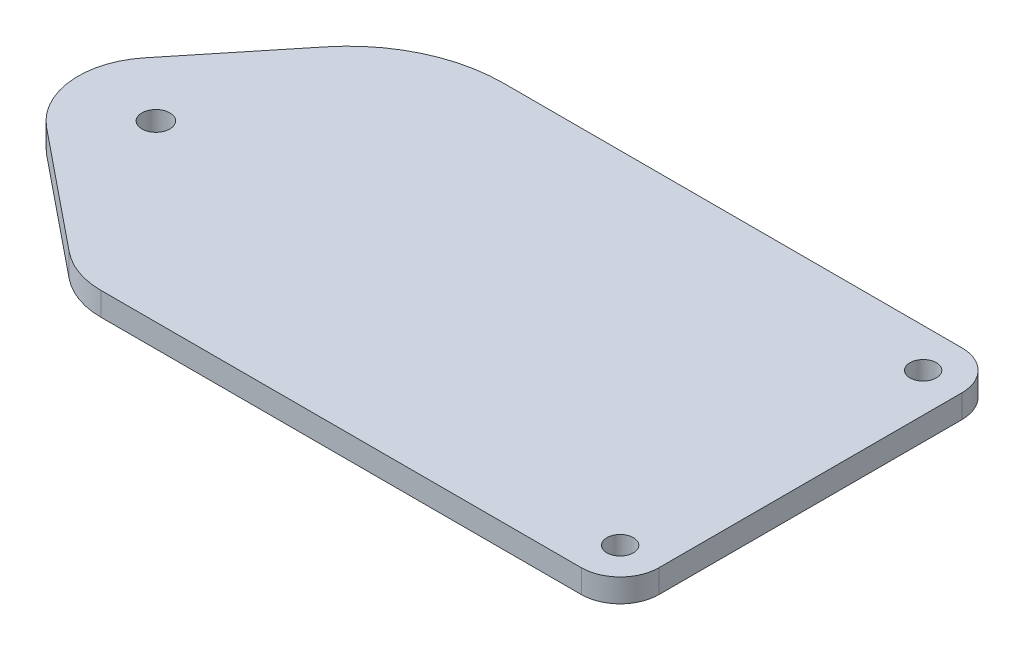
ISO-10303-21;
HEADER;
FILE_DESCRIPTION(('STEP AP214'),'2;1');
FILE_NAME('part.step','',(''),(''),'','','');
FILE_SCHEMA(('AUTOMOTIVE_DESIGN { 1 0 10303 214 1 1 1 1 }'));
ENDSEC;
DATA;
#1=APPLICATION_CONTEXT('core data for automotive mechanical design processes');
#2=APPLICATION_PROTOCOL_DEFINITION('international standard','automotive_design',2000,#1);
#3=PRODUCT_CONTEXT('',#1,'mechanical');
#4=PRODUCT('Part','Part','',(#3));
#5=PRODUCT_RELATED_PRODUCT_CATEGORY('part','',(#4));
#6=PRODUCT_DEFINITION_FORMATION('','',#4);
#7=PRODUCT_DEFINITION_CONTEXT('part definition',#1,'design');
#8=PRODUCT_DEFINITION('design','',#6,#7);
#9=PRODUCT_DEFINITION_SHAPE('','',#8);
#10=(LENGTH_UNIT() NAMED_UNIT(*) SI_UNIT(.MILLI.,.METRE.));
#11=(NAMED_UNIT(*) PLANE_ANGLE_UNIT() SI_UNIT($,.RADIAN.));
#12=(NAMED_UNIT(*) SI_UNIT($,.STERADIAN.) SOLID_ANGLE_UNIT());
#13=UNCERTAINTY_MEASURE_WITH_UNIT(LENGTH_MEASURE(1.E-05),#10,'distance_accuracy_value','');
#14=(GEOMETRIC_REPRESENTATION_CONTEXT(3) GLOBAL_UNCERTAINTY_ASSIGNED_CONTEXT((#13)) GLOBAL_UNIT_ASSIGNED_CONTEXT((#10,
#11,#12)) REPRESENTATION_CONTEXT('',''));
#15=CARTESIAN_POINT('',(0.,0.,0.));
#16=DIRECTION('',(0.,0.,1.));
#17=DIRECTION('',(1.,0.,0.));
#18=AXIS2_PLACEMENT_3D('',#15,#16,#17);
#19=CARTESIAN_POINT('',(22.832898339224,3.,-4.90714418224513));
#20=DIRECTION('',(0.,1.,0.));
#21=DIRECTION('',(0.,0.,1.));
#22=AXIS2_PLACEMENT_3D('',#19,#20,#21);
#23=PLANE('',#22);
#24=CARTESIAN_POINT('',(-54.3415677642179,3.,16.6724373208188));
#25=DIRECTION('',(0.,1.,0.));
#26=DIRECTION('',(0.,0.,1.));
#27=AXIS2_PLACEMENT_3D('',#24,#25,#26);
#28=CIRCLE('',#27,1.8);
#29=CARTESIAN_POINT('',(-54.3415677642179,3.,18.4724373208188));
#30=VERTEX_POINT('',#29);
#31=EDGE_CURVE('E304',#30,#30,#28,.T.);
#32=ORIENTED_EDGE('',*,*,#31,.F.);
#33=EDGE_LOOP('',(#32));
#34=FACE_BOUND('',#33,.T.);
#35=CARTESIAN_POINT('',(22.832898339224,3.,-4.90714418224513));
#36=DIRECTION('',(0.,1.,0.));
#37=DIRECTION('',(0.,0.,1.));
#38=AXIS2_PLACEMENT_3D('',#35,#36,#37);
#39=CIRCLE('',#38,1.7);
#40=CARTESIAN_POINT('',(22.832898339224,3.,-3.20714418224513));
#41=VERTEX_POINT('',#40);
#42=EDGE_CURVE('E160',#41,#41,#39,.T.);
#43=ORIENTED_EDGE('',*,*,#42,.F.);
#44=EDGE_LOOP('',(#43));
#45=FACE_BOUND('',#44,.T.);
#46=CARTESIAN_POINT('',(22.832898339224,3.,-4.90714418224513));
#47=DIRECTION('',(0.,1.,0.));
#48=DIRECTION('',(0.,0.,1.));
#49=AXIS2_PLACEMENT_3D('',#46,#47,#48);
#50=CIRCLE('',#49,5.);
#51=CARTESIAN_POINT('',(27.832898339224,3.,-4.90714418224509));
#52=VERTEX_POINT('',#51);
#53=CARTESIAN_POINT('',(22.832898339224,3.,-9.90714418224513));
#54=VERTEX_POINT('',#53);
#55=EDGE_CURVE('E176',#52,#54,#50,.T.);
#56=ORIENTED_EDGE('',*,*,#55,.T.);
#57=DIRECTION('',(-1.,0.,0.));
#58=VECTOR('',#57,1.);
#59=CARTESIAN_POINT('',(-36.1434619683259,3.,-9.90714418224513));
#60=LINE('',#59,#58);
#61=CARTESIAN_POINT('',(-36.1434619683259,3.,-9.90714418224513));
#62=VERTEX_POINT('',#61);
#63=EDGE_CURVE('E106',#54,#62,#60,.T.);
#64=ORIENTED_EDGE('',*,*,#63,.T.);
#65=CARTESIAN_POINT('',(-36.1434619683259,3.,10.0928558177549));
#66=DIRECTION('',(0.,1.,0.));
#67=DIRECTION('',(0.,0.,1.));
#68=AXIS2_PLACEMENT_3D('',#65,#66,#67);
#69=CIRCLE('',#68,20.);
#70=CARTESIAN_POINT('',(-51.684922643577,3.,-2.49535295393402));
#71=VERTEX_POINT('',#70);
#72=EDGE_CURVE('E198',#62,#71,#69,.T.);
#73=ORIENTED_EDGE('',*,*,#72,.T.);
#74=DIRECTION('',(-0.629410438584448,0.,0.77707303376255));
#75=VECTOR('',#74,1.);
#76=CARTESIAN_POINT('',(-51.684922643577,3.,-2.49535295393402));
#77=LINE('',#76,#75);
#78=CARTESIAN_POINT('',(-62.1122981018434,3.,10.3783329349743));
#79=VERTEX_POINT('',#78);
#80=EDGE_CURVE('E217',#71,#79,#77,.T.);
#81=ORIENTED_EDGE('',*,*,#80,.T.);
#82=CARTESIAN_POINT('',(-54.3415677642179,3.,16.6724373208188));
#83=DIRECTION('',(0.,1.,0.));
#84=DIRECTION('',(0.,0.,1.));
#85=AXIS2_PLACEMENT_3D('',#82,#83,#84);
#86=CIRCLE('',#85,10.);
#87=CARTESIAN_POINT('',(-60.6356721500624,3.,24.4431676584444));
#88=VERTEX_POINT('',#87);
#89=EDGE_CURVE('E214',#79,#88,#86,.T.);
#90=ORIENTED_EDGE('',*,*,#89,.T.);
#91=DIRECTION('',(0.77707303376255,0.,0.629410438584448));
#92=VECTOR('',#91,1.);
#93=CARTESIAN_POINT('',(-45.3013661227886,3.,36.8635861553804));
#94=LINE('',#93,#92);
#95=CARTESIAN_POINT('',(-45.3013661227886,3.,36.8635861553804));
#96=VERTEX_POINT('',#95);
#97=EDGE_CURVE('E216',#88,#96,#94,.T.);
#98=ORIENTED_EDGE('',*,*,#97,.T.);
#99=CARTESIAN_POINT('',(-39.0072617369441,3.,29.0928558177549));
#100=DIRECTION('',(0.,1.,0.));
#101=DIRECTION('',(0.,0.,-1.));
#102=AXIS2_PLACEMENT_3D('',#99,#100,#101);
#103=CIRCLE('',#102,10.);
#104=CARTESIAN_POINT('',(-39.007261736944,3.,39.0928558177549));
#105=VERTEX_POINT('',#104);
#106=EDGE_CURVE('E135',#96,#105,#103,.T.);
#107=ORIENTED_EDGE('',*,*,#106,.T.);
#108=DIRECTION('',(1.,0.,0.));
#109=VECTOR('',#108,1.);
#110=CARTESIAN_POINT('',(-39.007261736944,3.,39.0928558177549));
#111=LINE('',#110,#109);
#112=CARTESIAN_POINT('',(22.832898339224,3.,39.0928558177549));
#113=VERTEX_POINT('',#112);
#114=EDGE_CURVE('E128',#105,#113,#111,.T.);
#115=ORIENTED_EDGE('',*,*,#114,.T.);
#116=CARTESIAN_POINT('',(22.832898339224,3.,34.0928558177549));
#117=DIRECTION('',(0.,1.,0.));
#118=DIRECTION('',(0.,0.,-1.));
#119=AXIS2_PLACEMENT_3D('',#116,#117,#118);
#120=CIRCLE('',#119,5.);
#121=CARTESIAN_POINT('',(27.832898339224,3.,34.0928558177548));
#122=VERTEX_POINT('',#121);
#123=EDGE_CURVE('E132',#113,#122,#120,.T.);
#124=ORIENTED_EDGE('',*,*,#123,.T.);
#125=DIRECTION('',(0.,0.,-1.));
#126=VECTOR('',#125,1.);
#127=CARTESIAN_POINT('',(27.832898339224,3.,-4.90714418224509));
#128=LINE('',#127,#126);
#129=EDGE_CURVE('E59',#122,#52,#128,.T.);
#130=ORIENTED_EDGE('',*,*,#129,.T.);
#131=EDGE_LOOP('',(#56,#64,#73,#81,#90,#98,#107,#115,#124,#130));
#132=FACE_BOUND('',#131,.T.);
#133=CARTESIAN_POINT('',(22.832898339224,3.,34.0928558177549));
#134=DIRECTION('',(0.,1.,0.));
#135=DIRECTION('',(0.,0.,1.));
#136=AXIS2_PLACEMENT_3D('',#133,#134,#135);
#137=CIRCLE('',#136,1.7);
#138=CARTESIAN_POINT('',(22.832898339224,3.,35.7928558177549));
#139=VERTEX_POINT('',#138);
#140=EDGE_CURVE('E228',#139,#139,#137,.T.);
#141=ORIENTED_EDGE('',*,*,#140,.F.);
#142=EDGE_LOOP('',(#141));
#143=FACE_BOUND('',#142,.T.);
#144=ADVANCED_FACE('F34',(#34,#45,#132,#143),#23,.T.);
#145=CARTESIAN_POINT('',(22.832898339224,0.,-4.90714418224513));
#146=DIRECTION('',(0.,1.,0.));
#147=DIRECTION('',(0.,0.,1.));
#148=AXIS2_PLACEMENT_3D('',#145,#146,#147);
#149=PLANE('',#148);
#150=CARTESIAN_POINT('',(-54.3415677642179,0.,16.6724373208188));
#151=DIRECTION('',(0.,1.,0.));
#152=DIRECTION('',(0.,0.,1.));
#153=AXIS2_PLACEMENT_3D('',#150,#151,#152);
#154=CIRCLE('',#153,1.8);
#155=CARTESIAN_POINT('',(-54.3415677642179,0.,18.4724373208188));
#156=VERTEX_POINT('',#155);
#157=EDGE_CURVE('E38',#156,#156,#154,.T.);
#158=ORIENTED_EDGE('',*,*,#157,.T.);
#159=EDGE_LOOP('',(#158));
#160=FACE_BOUND('',#159,.T.);
#161=DIRECTION('',(1.,0.,0.));
#162=VECTOR('',#161,1.);
#163=CARTESIAN_POINT('',(0.,0.,-6.92704949976933));
#164=LINE('',#163,#162);
#165=CARTESIAN_POINT('',(-41.2166549540158,0.,-6.92704949976933));
#166=VERTEX_POINT('',#165);
#167=CARTESIAN_POINT('',(18.7833450459842,0.,-6.92704949976933));
#168=VERTEX_POINT('',#167);
#169=EDGE_CURVE('E276',#166,#168,#164,.T.);
#170=ORIENTED_EDGE('',*,*,#169,.F.);
#171=CARTESIAN_POINT('',(-41.2166549540158,0.,-5.92704949976933));
#172=DIRECTION('',(0.,-1.,0.));
#173=DIRECTION('',(0.,0.,-1.));
#174=AXIS2_PLACEMENT_3D('',#171,#172,#173);
#175=CIRCLE('',#174,1.);
#176=CARTESIAN_POINT('',(-42.2166549540158,0.,-5.92704949976933));
#177=VERTEX_POINT('',#176);
#178=EDGE_CURVE('E279',#166,#177,#175,.F.);
#179=ORIENTED_EDGE('',*,*,#178,.T.);
#180=DIRECTION('',(0.,0.,1.));
#181=VECTOR('',#180,1.);
#182=CARTESIAN_POINT('',(-42.2166549540158,0.,0.));
#183=LINE('',#182,#181);
#184=CARTESIAN_POINT('',(-42.2166549540158,0.,35.0729505002307));
#185=VERTEX_POINT('',#184);
#186=EDGE_CURVE('E259',#177,#185,#183,.T.);
#187=ORIENTED_EDGE('',*,*,#186,.T.);
#188=CARTESIAN_POINT('',(-41.2166549540158,0.,35.0729505002307));
#189=DIRECTION('',(0.,-1.,0.));
#190=DIRECTION('',(0.,0.,-1.));
#191=AXIS2_PLACEMENT_3D('',#188,#189,#190);
#192=CIRCLE('',#191,1.00000000000001);
#193=CARTESIAN_POINT('',(-41.2166549540158,0.,36.0729505002307));
#194=VERTEX_POINT('',#193);
#195=EDGE_CURVE('E50',#194,#185,#192,.T.);
#196=ORIENTED_EDGE('',*,*,#195,.F.);
#197=DIRECTION('',(1.,0.,0.));
#198=VECTOR('',#197,1.);
#199=CARTESIAN_POINT('',(0.,0.,36.0729505002307));
#200=LINE('',#199,#198);
#201=CARTESIAN_POINT('',(18.7833450459842,0.,36.0729505002307));
#202=VERTEX_POINT('',#201);
#203=EDGE_CURVE('E264',#194,#202,#200,.T.);
#204=ORIENTED_EDGE('',*,*,#203,.T.);
#205=CARTESIAN_POINT('',(18.7833450459842,0.,35.0729505002307));
#206=DIRECTION('',(0.,-1.,0.));
#207=DIRECTION('',(0.,0.,-1.));
#208=AXIS2_PLACEMENT_3D('',#205,#206,#207);
#209=CIRCLE('',#208,1.00000000000003);
#210=CARTESIAN_POINT('',(19.7833450459842,0.,35.0729505002307));
#211=VERTEX_POINT('',#210);
#212=EDGE_CURVE('E267',#211,#202,#209,.T.);
#213=ORIENTED_EDGE('',*,*,#212,.F.);
#214=DIRECTION('',(0.,0.,1.));
#215=VECTOR('',#214,1.);
#216=CARTESIAN_POINT('',(19.7833450459842,0.,0.));
#217=LINE('',#216,#215);
#218=CARTESIAN_POINT('',(19.7833450459842,0.,-5.92704949976933));
#219=VERTEX_POINT('',#218);
#220=EDGE_CURVE('E270',#219,#211,#217,.T.);
#221=ORIENTED_EDGE('',*,*,#220,.F.);
#222=CARTESIAN_POINT('',(18.7833450459842,0.,-5.92704949976933));
#223=DIRECTION('',(0.,-1.,0.));
#224=DIRECTION('',(0.,0.,-1.));
#225=AXIS2_PLACEMENT_3D('',#222,#223,#224);
#226=CIRCLE('',#225,1.);
#227=EDGE_CURVE('E273',#219,#168,#226,.F.);
#228=ORIENTED_EDGE('',*,*,#227,.T.);
#229=EDGE_LOOP('',(#170,#179,#187,#196,#204,#213,#221,#228));
#230=FACE_BOUND('',#229,.T.);
#231=CARTESIAN_POINT('',(22.832898339224,0.,-4.90714418224513));
#232=DIRECTION('',(0.,1.,0.));
#233=DIRECTION('',(0.,0.,1.));
#234=AXIS2_PLACEMENT_3D('',#231,#232,#233);
#235=CIRCLE('',#234,5.);
#236=CARTESIAN_POINT('',(27.832898339224,0.,-4.90714418224509));
#237=VERTEX_POINT('',#236);
#238=CARTESIAN_POINT('',(22.832898339224,0.,-9.90714418224513));
#239=VERTEX_POINT('',#238);
#240=EDGE_CURVE('E156',#237,#239,#235,.T.);
#241=ORIENTED_EDGE('',*,*,#240,.F.);
#242=DIRECTION('',(0.,0.,-1.));
#243=VECTOR('',#242,1.);
#244=CARTESIAN_POINT('',(27.832898339224,0.,-4.90714418224509));
#245=LINE('',#244,#243);
#246=CARTESIAN_POINT('',(27.832898339224,0.,34.0928558177548));
#247=VERTEX_POINT('',#246);
#248=EDGE_CURVE('E98',#247,#237,#245,.T.);
#249=ORIENTED_EDGE('',*,*,#248,.F.);
#250=CARTESIAN_POINT('',(22.832898339224,0.,34.0928558177549));
#251=DIRECTION('',(0.,1.,0.));
#252=DIRECTION('',(0.,0.,-1.));
#253=AXIS2_PLACEMENT_3D('',#250,#251,#252);
#254=CIRCLE('',#253,5.);
#255=CARTESIAN_POINT('',(22.832898339224,0.,39.0928558177549));
#256=VERTEX_POINT('',#255);
#257=EDGE_CURVE('E173',#256,#247,#254,.T.);
#258=ORIENTED_EDGE('',*,*,#257,.F.);
#259=DIRECTION('',(1.,0.,0.));
#260=VECTOR('',#259,1.);
#261=CARTESIAN_POINT('',(-39.007261736944,0.,39.0928558177549));
#262=LINE('',#261,#260);
#263=CARTESIAN_POINT('',(-39.007261736944,0.,39.0928558177549));
#264=VERTEX_POINT('',#263);
#265=EDGE_CURVE('E144',#264,#256,#262,.T.);
#266=ORIENTED_EDGE('',*,*,#265,.F.);
#267=CARTESIAN_POINT('',(-39.0072617369441,0.,29.0928558177549));
#268=DIRECTION('',(0.,1.,0.));
#269=DIRECTION('',(0.,0.,-1.));
#270=AXIS2_PLACEMENT_3D('',#267,#268,#269);
#271=CIRCLE('',#270,10.);
#272=CARTESIAN_POINT('',(-45.3013661227886,0.,36.8635861553804));
#273=VERTEX_POINT('',#272);
#274=EDGE_CURVE('E170',#273,#264,#271,.T.);
#275=ORIENTED_EDGE('',*,*,#274,.F.);
#276=DIRECTION('',(0.77707303376255,0.,0.629410438584448));
#277=VECTOR('',#276,1.);
#278=CARTESIAN_POINT('',(-45.3013661227886,0.,36.8635861553804));
#279=LINE('',#278,#277);
#280=CARTESIAN_POINT('',(-60.6356721500624,0.,24.4431676584444));
#281=VERTEX_POINT('',#280);
#282=EDGE_CURVE('E168',#281,#273,#279,.T.);
#283=ORIENTED_EDGE('',*,*,#282,.F.);
#284=CARTESIAN_POINT('',(-54.3415677642179,0.,16.6724373208188));
#285=DIRECTION('',(0.,1.,0.));
#286=DIRECTION('',(0.,0.,1.));
#287=AXIS2_PLACEMENT_3D('',#284,#285,#286);
#288=CIRCLE('',#287,10.);
#289=CARTESIAN_POINT('',(-62.1122981018434,0.,10.3783329349743));
#290=VERTEX_POINT('',#289);
#291=EDGE_CURVE('E166',#290,#281,#288,.T.);
#292=ORIENTED_EDGE('',*,*,#291,.F.);
#293=DIRECTION('',(-0.629410438584448,0.,0.77707303376255));
#294=VECTOR('',#293,1.);
#295=CARTESIAN_POINT('',(-51.684922643577,0.,-2.49535295393402));
#296=LINE('',#295,#294);
#297=CARTESIAN_POINT('',(-51.684922643577,0.,-2.49535295393402));
#298=VERTEX_POINT('',#297);
#299=EDGE_CURVE('E164',#298,#290,#296,.T.);
#300=ORIENTED_EDGE('',*,*,#299,.F.);
#301=CARTESIAN_POINT('',(-36.1434619683259,0.,10.0928558177549));
#302=DIRECTION('',(0.,1.,0.));
#303=DIRECTION('',(0.,0.,1.));
#304=AXIS2_PLACEMENT_3D('',#301,#302,#303);
#305=CIRCLE('',#304,20.);
#306=CARTESIAN_POINT('',(-36.1434619683259,0.,-9.90714418224513));
#307=VERTEX_POINT('',#306);
#308=EDGE_CURVE('E162',#307,#298,#305,.T.);
#309=ORIENTED_EDGE('',*,*,#308,.F.);
#310=DIRECTION('',(-1.,0.,0.));
#311=VECTOR('',#310,1.);
#312=CARTESIAN_POINT('',(-36.1434619683259,0.,-9.90714418224513));
#313=LINE('',#312,#311);
#314=EDGE_CURVE('E159',#239,#307,#313,.T.);
#315=ORIENTED_EDGE('',*,*,#314,.F.);
#316=EDGE_LOOP('',(#241,#249,#258,#266,#275,#283,#292,#300,#309,#315));
#317=FACE_BOUND('',#316,.T.);
#318=CARTESIAN_POINT('',(22.832898339224,0.,-4.90714418224513));
#319=DIRECTION('',(0.,1.,0.));
#320=DIRECTION('',(0.,0.,1.));
#321=AXIS2_PLACEMENT_3D('',#318,#319,#320);
#322=CIRCLE('',#321,1.7);
#323=CARTESIAN_POINT('',(22.832898339224,0.,-3.20714418224513));
#324=VERTEX_POINT('',#323);
#325=EDGE_CURVE('E225',#324,#324,#322,.T.);
#326=ORIENTED_EDGE('',*,*,#325,.T.);
#327=EDGE_LOOP('',(#326));
#328=FACE_BOUND('',#327,.T.);
#329=CARTESIAN_POINT('',(22.832898339224,0.,34.0928558177549));
#330=DIRECTION('',(0.,1.,0.));
#331=DIRECTION('',(0.,0.,1.));
#332=AXIS2_PLACEMENT_3D('',#329,#330,#331);
#333=CIRCLE('',#332,1.7);
#334=CARTESIAN_POINT('',(22.832898339224,0.,35.7928558177549));
#335=VERTEX_POINT('',#334);
#336=EDGE_CURVE('E231',#335,#335,#333,.T.);
#337=ORIENTED_EDGE('',*,*,#336,.T.);
#338=EDGE_LOOP('',(#337));
#339=FACE_BOUND('',#338,.T.);
#340=ADVANCED_FACE('F202',(#160,#230,#317,#328,#339),#149,.F.);
#341=CARTESIAN_POINT('',(22.832898339224,3.,-4.90714418224513));
#342=DIRECTION('',(0.,-1.,0.));
#343=DIRECTION('',(0.,0.,-1.));
#344=AXIS2_PLACEMENT_3D('',#341,#342,#343);
#345=CYLINDRICAL_SURFACE('',#344,5.);
#346=ORIENTED_EDGE('',*,*,#240,.T.);
#347=DIRECTION('',(0.,-1.,0.));
#348=VECTOR('',#347,1.);
#349=CARTESIAN_POINT('',(22.832898339224,3.,-9.90714418224513));
#350=LINE('',#349,#348);
#351=EDGE_CURVE('E11',#54,#239,#350,.T.);
#352=ORIENTED_EDGE('',*,*,#351,.F.);
#353=ORIENTED_EDGE('',*,*,#55,.F.);
#354=DIRECTION('',(0.,-1.,0.));
#355=VECTOR('',#354,1.);
#356=CARTESIAN_POINT('',(27.832898339224,3.,-4.90714418224509));
#357=LINE('',#356,#355);
#358=EDGE_CURVE('E152',#52,#237,#357,.T.);
#359=ORIENTED_EDGE('',*,*,#358,.T.);
#360=EDGE_LOOP('',(#346,#352,#353,#359));
#361=FACE_BOUND('',#360,.T.);
#362=ADVANCED_FACE('F36',(#361),#345,.T.);
#363=CARTESIAN_POINT('',(-36.1434619683259,3.,-9.90714418224513));
#364=DIRECTION('',(0.,0.,1.));
#365=DIRECTION('',(1.,0.,0.));
#366=AXIS2_PLACEMENT_3D('',#363,#364,#365);
#367=PLANE('',#366);
#368=ORIENTED_EDGE('',*,*,#314,.T.);
#369=DIRECTION('',(0.,-1.,0.));
#370=VECTOR('',#369,1.);
#371=CARTESIAN_POINT('',(-36.1434619683259,3.,-9.90714418224513));
#372=LINE('',#371,#370);
#373=EDGE_CURVE('E43',#62,#307,#372,.T.);
#374=ORIENTED_EDGE('',*,*,#373,.F.);
#375=ORIENTED_EDGE('',*,*,#63,.F.);
#376=ORIENTED_EDGE('',*,*,#351,.T.);
#377=EDGE_LOOP('',(#368,#374,#375,#376));
#378=FACE_BOUND('',#377,.T.);
#379=ADVANCED_FACE('F355',(#378),#367,.F.);
#380=CARTESIAN_POINT('',(-36.1434619683259,3.,10.0928558177549));
#381=DIRECTION('',(0.,-1.,0.));
#382=DIRECTION('',(0.,0.,-1.));
#383=AXIS2_PLACEMENT_3D('',#380,#381,#382);
#384=CYLINDRICAL_SURFACE('',#383,20.);
#385=ORIENTED_EDGE('',*,*,#308,.T.);
#386=DIRECTION('',(0.,-1.,0.));
#387=VECTOR('',#386,1.);
#388=CARTESIAN_POINT('',(-51.684922643577,3.,-2.49535295393402));
#389=LINE('',#388,#387);
#390=EDGE_CURVE('E189',#71,#298,#389,.T.);
#391=ORIENTED_EDGE('',*,*,#390,.F.);
#392=ORIENTED_EDGE('',*,*,#72,.F.);
#393=ORIENTED_EDGE('',*,*,#373,.T.);
#394=EDGE_LOOP('',(#385,#391,#392,#393));
#395=FACE_BOUND('',#394,.T.);
#396=ADVANCED_FACE('F196',(#395),#384,.T.);
#397=CARTESIAN_POINT('',(-51.684922643577,3.,-2.49535295393402));
#398=DIRECTION('',(0.77707303376255,0.,0.629410438584448));
#399=DIRECTION('',(0.629410438584448,0.,-0.77707303376255));
#400=AXIS2_PLACEMENT_3D('',#397,#398,#399);
#401=PLANE('',#400);
#402=ORIENTED_EDGE('',*,*,#299,.T.);
#403=DIRECTION('',(0.,-1.,0.));
#404=VECTOR('',#403,1.);
#405=CARTESIAN_POINT('',(-62.1122981018434,3.,10.3783329349743));
#406=LINE('',#405,#404);
#407=EDGE_CURVE('E186',#79,#290,#406,.T.);
#408=ORIENTED_EDGE('',*,*,#407,.F.);
#409=ORIENTED_EDGE('',*,*,#80,.F.);
#410=ORIENTED_EDGE('',*,*,#390,.T.);
#411=EDGE_LOOP('',(#402,#408,#409,#410));
#412=FACE_BOUND('',#411,.T.);
#413=ADVANCED_FACE('F208',(#412),#401,.F.);
#414=CARTESIAN_POINT('',(-54.3415677642179,3.,16.6724373208188));
#415=DIRECTION('',(0.,-1.,0.));
#416=DIRECTION('',(0.,0.,-1.));
#417=AXIS2_PLACEMENT_3D('',#414,#415,#416);
#418=CYLINDRICAL_SURFACE('',#417,10.);
#419=ORIENTED_EDGE('',*,*,#291,.T.);
#420=DIRECTION('',(0.,-1.,0.));
#421=VECTOR('',#420,1.);
#422=CARTESIAN_POINT('',(-60.6356721500624,3.,24.4431676584444));
#423=LINE('',#422,#421);
#424=EDGE_CURVE('E183',#88,#281,#423,.T.);
#425=ORIENTED_EDGE('',*,*,#424,.F.);
#426=ORIENTED_EDGE('',*,*,#89,.F.);
#427=ORIENTED_EDGE('',*,*,#407,.T.);
#428=EDGE_LOOP('',(#419,#425,#426,#427));
#429=FACE_BOUND('',#428,.T.);
#430=ADVANCED_FACE('F212',(#429),#418,.T.);
#431=CARTESIAN_POINT('',(-45.3013661227886,3.,36.8635861553804));
#432=DIRECTION('',(0.629410438584448,0.,-0.777073033762549));
#433=DIRECTION('',(-0.77707303376255,0.,-0.629410438584448));
#434=AXIS2_PLACEMENT_3D('',#431,#432,#433);
#435=PLANE('',#434);
#436=ORIENTED_EDGE('',*,*,#282,.T.);
#437=DIRECTION('',(0.,-1.,0.));
#438=VECTOR('',#437,1.);
#439=CARTESIAN_POINT('',(-45.3013661227886,3.,36.8635861553804));
#440=LINE('',#439,#438);
#441=EDGE_CURVE('E180',#96,#273,#440,.T.);
#442=ORIENTED_EDGE('',*,*,#441,.F.);
#443=ORIENTED_EDGE('',*,*,#97,.F.);
#444=ORIENTED_EDGE('',*,*,#424,.T.);
#445=EDGE_LOOP('',(#436,#442,#443,#444));
#446=FACE_BOUND('',#445,.T.);
#447=ADVANCED_FACE('F345',(#446),#435,.F.);
#448=CARTESIAN_POINT('',(-39.0072617369441,3.,29.0928558177549));
#449=DIRECTION('',(0.,-1.,0.));
#450=DIRECTION('',(0.,0.,-1.));
#451=AXIS2_PLACEMENT_3D('',#448,#449,#450);
#452=CYLINDRICAL_SURFACE('',#451,10.);
#453=ORIENTED_EDGE('',*,*,#274,.T.);
#454=DIRECTION('',(0.,-1.,0.));
#455=VECTOR('',#454,1.);
#456=CARTESIAN_POINT('',(-39.007261736944,3.,39.0928558177549));
#457=LINE('',#456,#455);
#458=EDGE_CURVE('E147',#105,#264,#457,.T.);
#459=ORIENTED_EDGE('',*,*,#458,.F.);
#460=ORIENTED_EDGE('',*,*,#106,.F.);
#461=ORIENTED_EDGE('',*,*,#441,.T.);
#462=EDGE_LOOP('',(#453,#459,#460,#461));
#463=FACE_BOUND('',#462,.T.);
#464=ADVANCED_FACE('F342',(#463),#452,.T.);
#465=CARTESIAN_POINT('',(-39.007261736944,3.,39.0928558177549));
#466=DIRECTION('',(0.,0.,-1.));
#467=DIRECTION('',(-1.,0.,0.));
#468=AXIS2_PLACEMENT_3D('',#465,#466,#467);
#469=PLANE('',#468);
#470=ORIENTED_EDGE('',*,*,#265,.T.);
#471=DIRECTION('',(0.,-1.,0.));
#472=VECTOR('',#471,1.);
#473=CARTESIAN_POINT('',(22.832898339224,3.,39.0928558177549));
#474=LINE('',#473,#472);
#475=EDGE_CURVE('E141',#113,#256,#474,.T.);
#476=ORIENTED_EDGE('',*,*,#475,.F.);
#477=ORIENTED_EDGE('',*,*,#114,.F.);
#478=ORIENTED_EDGE('',*,*,#458,.T.);
#479=EDGE_LOOP('',(#470,#476,#477,#478));
#480=FACE_BOUND('',#479,.T.);
#481=ADVANCED_FACE('F142',(#480),#469,.F.);
#482=CARTESIAN_POINT('',(22.832898339224,3.,34.0928558177549));
#483=DIRECTION('',(0.,-1.,0.));
#484=DIRECTION('',(0.,0.,-1.));
#485=AXIS2_PLACEMENT_3D('',#482,#483,#484);
#486=CYLINDRICAL_SURFACE('',#485,5.);
#487=ORIENTED_EDGE('',*,*,#257,.T.);
#488=DIRECTION('',(0.,-1.,0.));
#489=VECTOR('',#488,1.);
#490=CARTESIAN_POINT('',(27.832898339224,3.,34.0928558177548));
#491=LINE('',#490,#489);
#492=EDGE_CURVE('E148',#122,#247,#491,.T.);
#493=ORIENTED_EDGE('',*,*,#492,.F.);
#494=ORIENTED_EDGE('',*,*,#123,.F.);
#495=ORIENTED_EDGE('',*,*,#475,.T.);
#496=EDGE_LOOP('',(#487,#493,#494,#495));
#497=FACE_BOUND('',#496,.T.);
#498=ADVANCED_FACE('F150',(#497),#486,.T.);
#499=CARTESIAN_POINT('',(27.832898339224,3.,-4.90714418224509));
#500=DIRECTION('',(-1.,0.,0.));
#501=DIRECTION('',(0.,0.,1.));
#502=AXIS2_PLACEMENT_3D('',#499,#500,#501);
#503=PLANE('',#502);
#504=ORIENTED_EDGE('',*,*,#248,.T.);
#505=ORIENTED_EDGE('',*,*,#358,.F.);
#506=ORIENTED_EDGE('',*,*,#129,.F.);
#507=ORIENTED_EDGE('',*,*,#492,.T.);
#508=EDGE_LOOP('',(#504,#505,#506,#507));
#509=FACE_BOUND('',#508,.T.);
#510=ADVANCED_FACE('F335',(#509),#503,.F.);
#511=CARTESIAN_POINT('',(22.832898339224,3.,-4.90714418224513));
#512=DIRECTION('',(0.,-1.,0.));
#513=DIRECTION('',(0.,0.,-1.));
#514=AXIS2_PLACEMENT_3D('',#511,#512,#513);
#515=CYLINDRICAL_SURFACE('',#514,1.7);
#516=ORIENTED_EDGE('',*,*,#42,.T.);
#517=EDGE_LOOP('',(#516));
#518=FACE_BOUND('',#517,.T.);
#519=ORIENTED_EDGE('',*,*,#325,.F.);
#520=EDGE_LOOP('',(#519));
#521=FACE_BOUND('',#520,.T.);
#522=ADVANCED_FACE('F332',(#518,#521),#515,.F.);
#523=CARTESIAN_POINT('',(22.832898339224,3.,34.0928558177549));
#524=DIRECTION('',(0.,-1.,0.));
#525=DIRECTION('',(0.,0.,-1.));
#526=AXIS2_PLACEMENT_3D('',#523,#524,#525);
#527=CYLINDRICAL_SURFACE('',#526,1.7);
#528=ORIENTED_EDGE('',*,*,#140,.T.);
#529=EDGE_LOOP('',(#528));
#530=FACE_BOUND('',#529,.T.);
#531=ORIENTED_EDGE('',*,*,#336,.F.);
#532=EDGE_LOOP('',(#531));
#533=FACE_BOUND('',#532,.T.);
#534=ADVANCED_FACE('F454',(#530,#533),#527,.F.);
#535=CARTESIAN_POINT('',(-41.2166549540158,-3.,-5.92704949976933));
#536=DIRECTION('',(0.,1.,0.));
#537=DIRECTION('',(0.,0.,1.));
#538=AXIS2_PLACEMENT_3D('',#535,#536,#537);
#539=CYLINDRICAL_SURFACE('',#538,1.);
#540=ORIENTED_EDGE('',*,*,#178,.F.);
#541=DIRECTION('',(0.,1.,0.));
#542=VECTOR('',#541,1.);
#543=CARTESIAN_POINT('',(-41.2166549540158,-3.,-6.92704949976933));
#544=LINE('',#543,#542);
#545=CARTESIAN_POINT('',(-41.2166549540158,-3.,-6.92704949976933));
#546=VERTEX_POINT('',#545);
#547=EDGE_CURVE('E234',#546,#166,#544,.T.);
#548=ORIENTED_EDGE('',*,*,#547,.F.);
#549=CARTESIAN_POINT('',(-41.2166549540158,-3.,-5.92704949976933));
#550=DIRECTION('',(0.,-1.,0.));
#551=DIRECTION('',(0.,0.,-1.));
#552=AXIS2_PLACEMENT_3D('',#549,#550,#551);
#553=CIRCLE('',#552,1.);
#554=CARTESIAN_POINT('',(-42.2166549540158,-3.,-5.92704949976933));
#555=VERTEX_POINT('',#554);
#556=EDGE_CURVE('E262',#546,#555,#553,.F.);
#557=ORIENTED_EDGE('',*,*,#556,.T.);
#558=DIRECTION('',(0.,1.,0.));
#559=VECTOR('',#558,1.);
#560=CARTESIAN_POINT('',(-42.2166549540158,-3.,-5.92704949976933));
#561=LINE('',#560,#559);
#562=EDGE_CURVE('E255',#555,#177,#561,.T.);
#563=ORIENTED_EDGE('',*,*,#562,.T.);
#564=EDGE_LOOP('',(#540,#548,#557,#563));
#565=FACE_BOUND('',#564,.T.);
#566=ADVANCED_FACE('F445',(#565),#539,.T.);
#567=CARTESIAN_POINT('',(0.,-3.,-6.92704949976933));
#568=DIRECTION('',(0.,0.,1.));
#569=DIRECTION('',(1.,0.,0.));
#570=AXIS2_PLACEMENT_3D('',#567,#568,#569);
#571=PLANE('',#570);
#572=ORIENTED_EDGE('',*,*,#169,.T.);
#573=DIRECTION('',(0.,1.,0.));
#574=VECTOR('',#573,1.);
#575=CARTESIAN_POINT('',(18.7833450459842,-3.,-6.92704949976933));
#576=LINE('',#575,#574);
#577=CARTESIAN_POINT('',(18.7833450459842,-3.,-6.92704949976933));
#578=VERTEX_POINT('',#577);
#579=EDGE_CURVE('E239',#578,#168,#576,.T.);
#580=ORIENTED_EDGE('',*,*,#579,.F.);
#581=DIRECTION('',(1.,0.,0.));
#582=VECTOR('',#581,1.);
#583=CARTESIAN_POINT('',(0.,-3.,-6.92704949976933));
#584=LINE('',#583,#582);
#585=EDGE_CURVE('E299',#546,#578,#584,.T.);
#586=ORIENTED_EDGE('',*,*,#585,.F.);
#587=ORIENTED_EDGE('',*,*,#547,.T.);
#588=EDGE_LOOP('',(#572,#580,#586,#587));
#589=FACE_BOUND('',#588,.T.);
#590=ADVANCED_FACE('F436',(#589),#571,.F.);
#591=CARTESIAN_POINT('',(18.7833450459842,-3.,-5.92704949976933));
#592=DIRECTION('',(0.,1.,0.));
#593=DIRECTION('',(0.,0.,1.));
#594=AXIS2_PLACEMENT_3D('',#591,#592,#593);
#595=CYLINDRICAL_SURFACE('',#594,1.);
#596=ORIENTED_EDGE('',*,*,#227,.F.);
#597=DIRECTION('',(0.,1.,0.));
#598=VECTOR('',#597,1.);
#599=CARTESIAN_POINT('',(19.7833450459842,-3.,-5.92704949976933));
#600=LINE('',#599,#598);
#601=CARTESIAN_POINT('',(19.7833450459842,-3.,-5.92704949976933));
#602=VERTEX_POINT('',#601);
#603=EDGE_CURVE('E242',#602,#219,#600,.T.);
#604=ORIENTED_EDGE('',*,*,#603,.F.);
#605=CARTESIAN_POINT('',(18.7833450459842,-3.,-5.92704949976933));
#606=DIRECTION('',(0.,-1.,0.));
#607=DIRECTION('',(0.,0.,-1.));
#608=AXIS2_PLACEMENT_3D('',#605,#606,#607);
#609=CIRCLE('',#608,1.);
#610=EDGE_CURVE('E296',#602,#578,#609,.F.);
#611=ORIENTED_EDGE('',*,*,#610,.T.);
#612=ORIENTED_EDGE('',*,*,#579,.T.);
#613=EDGE_LOOP('',(#596,#604,#611,#612));
#614=FACE_BOUND('',#613,.T.);
#615=ADVANCED_FACE('F427',(#614),#595,.T.);
#616=CARTESIAN_POINT('',(19.7833450459842,-3.,0.));
#617=DIRECTION('',(-1.,0.,0.));
#618=DIRECTION('',(0.,0.,1.));
#619=AXIS2_PLACEMENT_3D('',#616,#617,#618);
#620=PLANE('',#619);
#621=ORIENTED_EDGE('',*,*,#220,.T.);
#622=DIRECTION('',(0.,1.,0.));
#623=VECTOR('',#622,1.);
#624=CARTESIAN_POINT('',(19.7833450459842,-3.,35.0729505002307));
#625=LINE('',#624,#623);
#626=CARTESIAN_POINT('',(19.7833450459842,-3.,35.0729505002307));
#627=VERTEX_POINT('',#626);
#628=EDGE_CURVE('E245',#627,#211,#625,.T.);
#629=ORIENTED_EDGE('',*,*,#628,.F.);
#630=DIRECTION('',(0.,0.,1.));
#631=VECTOR('',#630,1.);
#632=CARTESIAN_POINT('',(19.7833450459842,-3.,0.));
#633=LINE('',#632,#631);
#634=EDGE_CURVE('E293',#602,#627,#633,.T.);
#635=ORIENTED_EDGE('',*,*,#634,.F.);
#636=ORIENTED_EDGE('',*,*,#603,.T.);
#637=EDGE_LOOP('',(#621,#629,#635,#636));
#638=FACE_BOUND('',#637,.T.);
#639=ADVANCED_FACE('F418',(#638),#620,.F.);
#640=CARTESIAN_POINT('',(18.7833450459842,-3.,35.0729505002307));
#641=DIRECTION('',(0.,1.,0.));
#642=DIRECTION('',(0.,0.,1.));
#643=AXIS2_PLACEMENT_3D('',#640,#641,#642);
#644=CYLINDRICAL_SURFACE('',#643,1.00000000000003);
#645=ORIENTED_EDGE('',*,*,#212,.T.);
#646=DIRECTION('',(0.,1.,0.));
#647=VECTOR('',#646,1.);
#648=CARTESIAN_POINT('',(18.7833450459842,-3.,36.0729505002307));
#649=LINE('',#648,#647);
#650=CARTESIAN_POINT('',(18.7833450459842,-3.,36.0729505002307));
#651=VERTEX_POINT('',#650);
#652=EDGE_CURVE('E248',#651,#202,#649,.T.);
#653=ORIENTED_EDGE('',*,*,#652,.F.);
#654=CARTESIAN_POINT('',(18.7833450459842,-3.,35.0729505002307));
#655=DIRECTION('',(0.,-1.,0.));
#656=DIRECTION('',(0.,0.,-1.));
#657=AXIS2_PLACEMENT_3D('',#654,#655,#656);
#658=CIRCLE('',#657,1.00000000000003);
#659=EDGE_CURVE('E290',#627,#651,#658,.T.);
#660=ORIENTED_EDGE('',*,*,#659,.F.);
#661=ORIENTED_EDGE('',*,*,#628,.T.);
#662=EDGE_LOOP('',(#645,#653,#660,#661));
#663=FACE_BOUND('',#662,.T.);
#664=ADVANCED_FACE('F409',(#663),#644,.T.);
#665=CARTESIAN_POINT('',(0.,-3.,36.0729505002307));
#666=DIRECTION('',(0.,0.,1.));
#667=DIRECTION('',(1.,0.,0.));
#668=AXIS2_PLACEMENT_3D('',#665,#666,#667);
#669=PLANE('',#668);
#670=ORIENTED_EDGE('',*,*,#203,.F.);
#671=DIRECTION('',(0.,1.,0.));
#672=VECTOR('',#671,1.);
#673=CARTESIAN_POINT('',(-41.2166549540158,-3.,36.0729505002307));
#674=LINE('',#673,#672);
#675=CARTESIAN_POINT('',(-41.2166549540158,-3.,36.0729505002307));
#676=VERTEX_POINT('',#675);
#677=EDGE_CURVE('E251',#676,#194,#674,.T.);
#678=ORIENTED_EDGE('',*,*,#677,.F.);
#679=DIRECTION('',(1.,0.,0.));
#680=VECTOR('',#679,1.);
#681=CARTESIAN_POINT('',(0.,-3.,36.0729505002307));
#682=LINE('',#681,#680);
#683=EDGE_CURVE('E287',#676,#651,#682,.T.);
#684=ORIENTED_EDGE('',*,*,#683,.T.);
#685=ORIENTED_EDGE('',*,*,#652,.T.);
#686=EDGE_LOOP('',(#670,#678,#684,#685));
#687=FACE_BOUND('',#686,.T.);
#688=ADVANCED_FACE('F401',(#687),#669,.T.);
#689=CARTESIAN_POINT('',(-41.2166549540158,-3.,35.0729505002307));
#690=DIRECTION('',(0.,1.,0.));
#691=DIRECTION('',(0.,0.,1.));
#692=AXIS2_PLACEMENT_3D('',#689,#690,#691);
#693=CYLINDRICAL_SURFACE('',#692,1.00000000000001);
#694=ORIENTED_EDGE('',*,*,#195,.T.);
#695=DIRECTION('',(0.,1.,0.));
#696=VECTOR('',#695,1.);
#697=CARTESIAN_POINT('',(-42.2166549540158,-3.,35.0729505002307));
#698=LINE('',#697,#696);
#699=CARTESIAN_POINT('',(-42.2166549540158,-3.,35.0729505002307));
#700=VERTEX_POINT('',#699);
#701=EDGE_CURVE('E253',#700,#185,#698,.T.);
#702=ORIENTED_EDGE('',*,*,#701,.F.);
#703=CARTESIAN_POINT('',(-41.2166549540158,-3.,35.0729505002307));
#704=DIRECTION('',(0.,-1.,0.));
#705=DIRECTION('',(0.,0.,-1.));
#706=AXIS2_PLACEMENT_3D('',#703,#704,#705);
#707=CIRCLE('',#706,1.00000000000001);
#708=EDGE_CURVE('E284',#676,#700,#707,.T.);
#709=ORIENTED_EDGE('',*,*,#708,.F.);
#710=ORIENTED_EDGE('',*,*,#677,.T.);
#711=EDGE_LOOP('',(#694,#702,#709,#710));
#712=FACE_BOUND('',#711,.T.);
#713=ADVANCED_FACE('F392',(#712),#693,.T.);
#714=CARTESIAN_POINT('',(-42.2166549540158,-3.,0.));
#715=DIRECTION('',(-1.,0.,0.));
#716=DIRECTION('',(0.,0.,1.));
#717=AXIS2_PLACEMENT_3D('',#714,#715,#716);
#718=PLANE('',#717);
#719=ORIENTED_EDGE('',*,*,#186,.F.);
#720=ORIENTED_EDGE('',*,*,#562,.F.);
#721=DIRECTION('',(0.,0.,1.));
#722=VECTOR('',#721,1.);
#723=CARTESIAN_POINT('',(-42.2166549540158,-3.,0.));
#724=LINE('',#723,#722);
#725=EDGE_CURVE('E258',#555,#700,#724,.T.);
#726=ORIENTED_EDGE('',*,*,#725,.T.);
#727=ORIENTED_EDGE('',*,*,#701,.T.);
#728=EDGE_LOOP('',(#719,#720,#726,#727));
#729=FACE_BOUND('',#728,.T.);
#730=ADVANCED_FACE('F320',(#729),#718,.T.);
#731=CARTESIAN_POINT('',(0.,-3.,0.));
#732=DIRECTION('',(0.,-1.,0.));
#733=DIRECTION('',(0.,0.,-1.));
#734=AXIS2_PLACEMENT_3D('',#731,#732,#733);
#735=PLANE('',#734);
#736=ORIENTED_EDGE('',*,*,#556,.F.);
#737=ORIENTED_EDGE('',*,*,#585,.T.);
#738=ORIENTED_EDGE('',*,*,#610,.F.);
#739=ORIENTED_EDGE('',*,*,#634,.T.);
#740=ORIENTED_EDGE('',*,*,#659,.T.);
#741=ORIENTED_EDGE('',*,*,#683,.F.);
#742=ORIENTED_EDGE('',*,*,#708,.T.);
#743=ORIENTED_EDGE('',*,*,#725,.F.);
#744=EDGE_LOOP('',(#736,#737,#738,#739,#740,#741,#742,#743));
#745=FACE_BOUND('',#744,.T.);
#746=ADVANCED_FACE('F315',(#745),#735,.T.);
#747=CARTESIAN_POINT('',(-54.3415677642179,-2.,16.6724373208188));
#748=DIRECTION('',(0.,1.,0.));
#749=DIRECTION('',(0.,0.,1.));
#750=AXIS2_PLACEMENT_3D('',#747,#748,#749);
#751=CYLINDRICAL_SURFACE('',#750,1.8);
#752=ORIENTED_EDGE('',*,*,#31,.T.);
#753=EDGE_LOOP('',(#752));
#754=FACE_BOUND('',#753,.T.);
#755=ORIENTED_EDGE('',*,*,#157,.F.);
#756=EDGE_LOOP('',(#755));
#757=FACE_BOUND('',#756,.T.);
#758=ADVANCED_FACE('F313',(#754,#757),#751,.F.);
#759=CLOSED_SHELL('',(#144,#340,#362,#379,#396,#413,#430,#447,#464,#481,#498,#510,#522,#534,
#566,#590,#615,#639,#664,#688,#713,#730,#746,#758));
#760=MANIFOLD_SOLID_BREP('B2',#759);
#761=ADVANCED_BREP_SHAPE_REPRESENTATION('',(#18,#760),#14);
#762=SHAPE_DEFINITION_REPRESENTATION(#9,#761);
ENDSEC;
END-ISO-10303-21;
